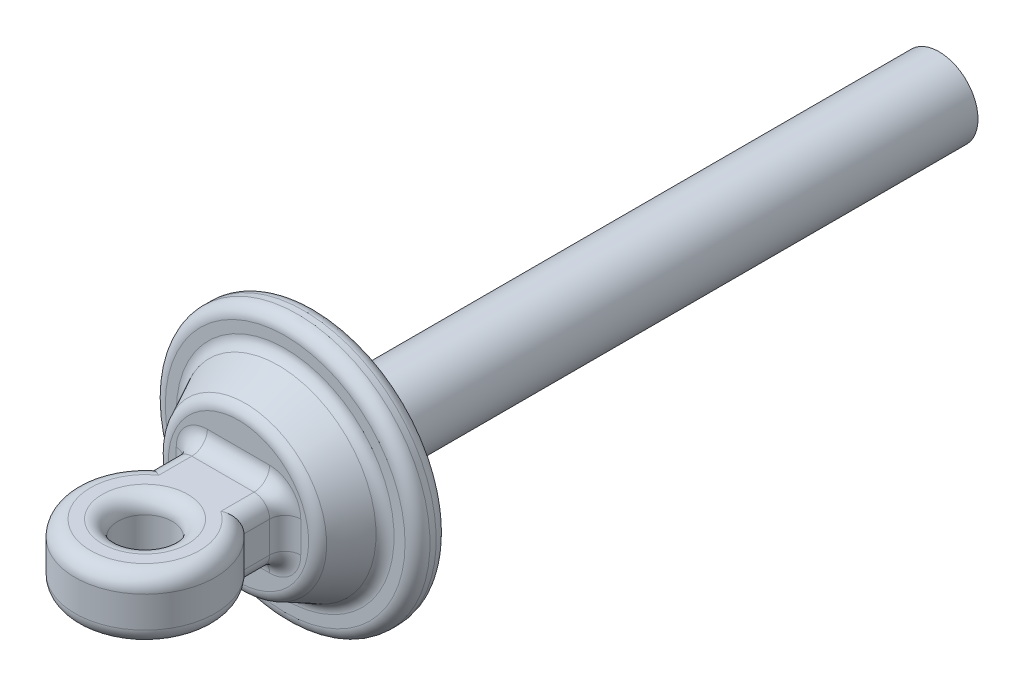
ISO-10303-21;
HEADER;
FILE_DESCRIPTION(('STEP AP214'),'2;1');
FILE_NAME('part.step','',(''),(''),'','','');
FILE_SCHEMA(('AUTOMOTIVE_DESIGN { 1 0 10303 214 1 1 1 1 }'));
ENDSEC;
DATA;
#1=APPLICATION_CONTEXT('core data for automotive mechanical design processes');
#2=APPLICATION_PROTOCOL_DEFINITION('international standard','automotive_design',2000,#1);
#3=PRODUCT_CONTEXT('',#1,'mechanical');
#4=PRODUCT('Part','Part','',(#3));
#5=PRODUCT_RELATED_PRODUCT_CATEGORY('part','',(#4));
#6=PRODUCT_DEFINITION_FORMATION('','',#4);
#7=PRODUCT_DEFINITION_CONTEXT('part definition',#1,'design');
#8=PRODUCT_DEFINITION('design','',#6,#7);
#9=PRODUCT_DEFINITION_SHAPE('','',#8);
#10=(LENGTH_UNIT() NAMED_UNIT(*) SI_UNIT(.MILLI.,.METRE.));
#11=(NAMED_UNIT(*) PLANE_ANGLE_UNIT() SI_UNIT($,.RADIAN.));
#12=(NAMED_UNIT(*) SI_UNIT($,.STERADIAN.) SOLID_ANGLE_UNIT());
#13=UNCERTAINTY_MEASURE_WITH_UNIT(LENGTH_MEASURE(1.E-05),#10,'distance_accuracy_value','');
#14=(GEOMETRIC_REPRESENTATION_CONTEXT(3) GLOBAL_UNCERTAINTY_ASSIGNED_CONTEXT((#13)) GLOBAL_UNIT_ASSIGNED_CONTEXT((#10,
#11,#12)) REPRESENTATION_CONTEXT('',''));
#15=CARTESIAN_POINT('',(0.,0.,0.));
#16=DIRECTION('',(0.,0.,1.));
#17=DIRECTION('',(1.,0.,0.));
#18=AXIS2_PLACEMENT_3D('',#15,#16,#17);
#19=CARTESIAN_POINT('',(0.,0.,45.));
#20=DIRECTION('',(0.,0.,-1.));
#21=DIRECTION('',(-1.,0.,0.));
#22=AXIS2_PLACEMENT_3D('',#19,#20,#21);
#23=PLANE('',#22);
#24=CARTESIAN_POINT('',(0.,0.,45.));
#25=DIRECTION('',(0.,0.,-1.));
#26=DIRECTION('',(-1.,0.,0.));
#27=AXIS2_PLACEMENT_3D('',#24,#25,#26);
#28=CIRCLE('',#27,4.50557280900008);
#29=CARTESIAN_POINT('',(-4.50557280900008,0.,45.));
#30=VERTEX_POINT('',#29);
#31=EDGE_CURVE('E243',#30,#30,#28,.T.);
#32=ORIENTED_EDGE('',*,*,#31,.F.);
#33=EDGE_LOOP('',(#32));
#34=FACE_BOUND('',#33,.T.);
#35=CARTESIAN_POINT('',(-2.,1.,45.));
#36=DIRECTION('',(0.,0.,-1.));
#37=DIRECTION('',(-1.,0.,0.));
#38=AXIS2_PLACEMENT_3D('',#35,#36,#37);
#39=CIRCLE('',#38,2.);
#40=CARTESIAN_POINT('',(-2.,3.,45.));
#41=VERTEX_POINT('',#40);
#42=CARTESIAN_POINT('',(-4.,1.,45.));
#43=VERTEX_POINT('',#42);
#44=EDGE_CURVE('E270',#41,#43,#39,.F.);
#45=ORIENTED_EDGE('',*,*,#44,.F.);
#46=DIRECTION('',(1.,0.,0.));
#47=VECTOR('',#46,1.);
#48=CARTESIAN_POINT('',(0.,3.,45.));
#49=LINE('',#48,#47);
#50=CARTESIAN_POINT('',(2.,3.,45.));
#51=VERTEX_POINT('',#50);
#52=EDGE_CURVE('E267',#41,#51,#49,.T.);
#53=ORIENTED_EDGE('',*,*,#52,.T.);
#54=CARTESIAN_POINT('',(2.,1.,45.));
#55=DIRECTION('',(0.,0.,-1.));
#56=DIRECTION('',(-1.,0.,0.));
#57=AXIS2_PLACEMENT_3D('',#54,#55,#56);
#58=CIRCLE('',#57,2.);
#59=CARTESIAN_POINT('',(4.,1.,45.));
#60=VERTEX_POINT('',#59);
#61=EDGE_CURVE('E263',#60,#51,#58,.F.);
#62=ORIENTED_EDGE('',*,*,#61,.F.);
#63=DIRECTION('',(0.,-1.,0.));
#64=VECTOR('',#63,1.);
#65=CARTESIAN_POINT('',(4.,0.,45.));
#66=LINE('',#65,#64);
#67=CARTESIAN_POINT('',(4.,-1.,45.));
#68=VERTEX_POINT('',#67);
#69=EDGE_CURVE('E259',#60,#68,#66,.T.);
#70=ORIENTED_EDGE('',*,*,#69,.T.);
#71=CARTESIAN_POINT('',(2.,-1.,45.));
#72=DIRECTION('',(0.,0.,-1.));
#73=DIRECTION('',(-1.,0.,0.));
#74=AXIS2_PLACEMENT_3D('',#71,#72,#73);
#75=CIRCLE('',#74,2.);
#76=CARTESIAN_POINT('',(2.,-3.,45.));
#77=VERTEX_POINT('',#76);
#78=EDGE_CURVE('E177',#77,#68,#75,.F.);
#79=ORIENTED_EDGE('',*,*,#78,.F.);
#80=DIRECTION('',(1.,0.,0.));
#81=VECTOR('',#80,1.);
#82=CARTESIAN_POINT('',(-3.,-3.,45.));
#83=LINE('',#82,#81);
#84=CARTESIAN_POINT('',(-2.,-3.,45.));
#85=VERTEX_POINT('',#84);
#86=EDGE_CURVE('E159',#77,#85,#83,.F.);
#87=ORIENTED_EDGE('',*,*,#86,.T.);
#88=CARTESIAN_POINT('',(-2.,-1.,45.));
#89=DIRECTION('',(0.,0.,-1.));
#90=DIRECTION('',(-1.,0.,0.));
#91=AXIS2_PLACEMENT_3D('',#88,#89,#90);
#92=CIRCLE('',#91,2.);
#93=CARTESIAN_POINT('',(-4.,-1.,45.));
#94=VERTEX_POINT('',#93);
#95=EDGE_CURVE('E154',#94,#85,#92,.F.);
#96=ORIENTED_EDGE('',*,*,#95,.F.);
#97=DIRECTION('',(0.,-1.,0.));
#98=VECTOR('',#97,1.);
#99=CARTESIAN_POINT('',(-4.,2.,45.));
#100=LINE('',#99,#98);
#101=EDGE_CURVE('E156',#94,#43,#100,.F.);
#102=ORIENTED_EDGE('',*,*,#101,.T.);
#103=EDGE_LOOP('',(#45,#53,#62,#70,#79,#87,#96,#102));
#104=FACE_BOUND('',#103,.T.);
#105=ADVANCED_FACE('F58',(#34,#104),#23,.F.);
#106=CARTESIAN_POINT('',(0.,0.,40.));
#107=DIRECTION('',(0.,0.,-1.));
#108=DIRECTION('',(-1.,0.,0.));
#109=AXIS2_PLACEMENT_3D('',#106,#107,#108);
#110=CYLINDRICAL_SURFACE('',#109,2.5);
#111=CARTESIAN_POINT('',(0.,0.,40.));
#112=DIRECTION('',(0.,0.,1.));
#113=DIRECTION('',(1.,0.,0.));
#114=AXIS2_PLACEMENT_3D('',#111,#112,#113);
#115=CIRCLE('',#114,2.5);
#116=CARTESIAN_POINT('',(2.5,0.,40.));
#117=VERTEX_POINT('',#116);
#118=EDGE_CURVE('E165',#117,#117,#115,.T.);
#119=ORIENTED_EDGE('',*,*,#118,.F.);
#120=EDGE_LOOP('',(#119));
#121=FACE_BOUND('',#120,.T.);
#122=CARTESIAN_POINT('',(0.,0.,0.));
#123=DIRECTION('',(0.,0.,1.));
#124=DIRECTION('',(1.,0.,0.));
#125=AXIS2_PLACEMENT_3D('',#122,#123,#124);
#126=CIRCLE('',#125,2.5);
#127=CARTESIAN_POINT('',(2.5,0.,0.));
#128=VERTEX_POINT('',#127);
#129=EDGE_CURVE('E247',#128,#128,#126,.T.);
#130=ORIENTED_EDGE('',*,*,#129,.T.);
#131=EDGE_LOOP('',(#130));
#132=FACE_BOUND('',#131,.T.);
#133=ADVANCED_FACE('F435',(#121,#132),#110,.T.);
#134=CARTESIAN_POINT('',(0.,0.,0.));
#135=DIRECTION('',(0.,0.,1.));
#136=DIRECTION('',(1.,0.,0.));
#137=AXIS2_PLACEMENT_3D('',#134,#135,#136);
#138=PLANE('',#137);
#139=ORIENTED_EDGE('',*,*,#129,.F.);
#140=EDGE_LOOP('',(#139));
#141=FACE_BOUND('',#140,.T.);
#142=ADVANCED_FACE('F441',(#141),#138,.F.);
#143=CARTESIAN_POINT('',(0.,0.,40.));
#144=DIRECTION('',(0.,0.,1.));
#145=DIRECTION('',(1.,0.,0.));
#146=AXIS2_PLACEMENT_3D('',#143,#144,#145);
#147=PLANE('',#146);
#148=ORIENTED_EDGE('',*,*,#118,.T.);
#149=EDGE_LOOP('',(#148));
#150=FACE_BOUND('',#149,.T.);
#151=CARTESIAN_POINT('',(0.,0.,40.));
#152=DIRECTION('',(0.,0.,-1.));
#153=DIRECTION('',(-1.,0.,0.));
#154=AXIS2_PLACEMENT_3D('',#151,#152,#153);
#155=CIRCLE('',#154,7.69999999999999);
#156=CARTESIAN_POINT('',(-7.69999999999999,0.,40.));
#157=VERTEX_POINT('',#156);
#158=EDGE_CURVE('E213',#157,#157,#155,.T.);
#159=ORIENTED_EDGE('',*,*,#158,.T.);
#160=EDGE_LOOP('',(#159));
#161=FACE_BOUND('',#160,.T.);
#162=ADVANCED_FACE('F449',(#150,#161),#147,.F.);
#163=CARTESIAN_POINT('',(0.,0.,44.2));
#164=DIRECTION('',(0.,0.,-1.));
#165=DIRECTION('',(-1.,0.,0.));
#166=AXIS2_PLACEMENT_3D('',#163,#164,#165);
#167=TOROIDAL_SURFACE('',#166,4.50557280900008,0.800000000000002);
#168=CARTESIAN_POINT('',(0.,0.,44.5577708764));
#169=DIRECTION('',(0.,0.,-1.));
#170=DIRECTION('',(-1.,0.,0.));
#171=AXIS2_PLACEMENT_3D('',#168,#169,#170);
#172=CIRCLE('',#171,5.22111456180002);
#173=CARTESIAN_POINT('',(-5.22111456180002,0.,44.5577708764));
#174=VERTEX_POINT('',#173);
#175=EDGE_CURVE('E239',#174,#174,#172,.T.);
#176=ORIENTED_EDGE('',*,*,#175,.F.);
#177=EDGE_LOOP('',(#176));
#178=FACE_BOUND('',#177,.T.);
#179=ORIENTED_EDGE('',*,*,#31,.T.);
#180=EDGE_LOOP('',(#179));
#181=FACE_BOUND('',#180,.T.);
#182=ADVANCED_FACE('F447',(#178,#181),#167,.T.);
#183=CARTESIAN_POINT('',(0.,0.,44.5577708764));
#184=DIRECTION('',(0.,0.,-1.));
#185=DIRECTION('',(-1.,0.,0.));
#186=AXIS2_PLACEMENT_3D('',#183,#184,#185);
#187=CONICAL_SURFACE('',#186,5.22111456180002,0.463647609000805);
#188=CARTESIAN_POINT('',(0.,0.,42.4422291236));
#189=DIRECTION('',(0.,0.,-1.));
#190=DIRECTION('',(-1.,0.,0.));
#191=AXIS2_PLACEMENT_3D('',#188,#189,#190);
#192=CIRCLE('',#191,6.27888543819998);
#193=CARTESIAN_POINT('',(-6.27888543819998,0.,42.4422291236));
#194=VERTEX_POINT('',#193);
#195=EDGE_CURVE('E235',#194,#194,#192,.T.);
#196=ORIENTED_EDGE('',*,*,#195,.F.);
#197=EDGE_LOOP('',(#196));
#198=FACE_BOUND('',#197,.T.);
#199=ORIENTED_EDGE('',*,*,#175,.T.);
#200=EDGE_LOOP('',(#199));
#201=FACE_BOUND('',#200,.T.);
#202=ADVANCED_FACE('F527',(#198,#201),#187,.T.);
#203=CARTESIAN_POINT('',(0.,0.,42.8));
#204=DIRECTION('',(0.,0.,-1.));
#205=DIRECTION('',(-1.,0.,0.));
#206=AXIS2_PLACEMENT_3D('',#203,#204,#205);
#207=TOROIDAL_SURFACE('',#206,6.99442719099992,0.800000000000002);
#208=CARTESIAN_POINT('',(0.,0.,42.));
#209=DIRECTION('',(0.,0.,-1.));
#210=DIRECTION('',(-1.,0.,0.));
#211=AXIS2_PLACEMENT_3D('',#208,#209,#210);
#212=CIRCLE('',#211,6.99442719099992);
#213=CARTESIAN_POINT('',(-6.99442719099992,0.,42.));
#214=VERTEX_POINT('',#213);
#215=EDGE_CURVE('E231',#214,#214,#212,.T.);
#216=ORIENTED_EDGE('',*,*,#215,.F.);
#217=EDGE_LOOP('',(#216));
#218=FACE_BOUND('',#217,.T.);
#219=ORIENTED_EDGE('',*,*,#195,.T.);
#220=EDGE_LOOP('',(#219));
#221=FACE_BOUND('',#220,.T.);
#222=ADVANCED_FACE('F524',(#218,#221),#207,.F.);
#223=CARTESIAN_POINT('',(6.99442719099992,0.,42.));
#224=DIRECTION('',(0.,0.,-1.));
#225=DIRECTION('',(-1.,0.,0.));
#226=AXIS2_PLACEMENT_3D('',#223,#224,#225);
#227=PLANE('',#226);
#228=CARTESIAN_POINT('',(0.,0.,42.));
#229=DIRECTION('',(0.,0.,-1.));
#230=DIRECTION('',(-1.,0.,0.));
#231=AXIS2_PLACEMENT_3D('',#228,#229,#230);
#232=CIRCLE('',#231,7.69999999999999);
#233=CARTESIAN_POINT('',(-7.69999999999999,0.,42.));
#234=VERTEX_POINT('',#233);
#235=EDGE_CURVE('E227',#234,#234,#232,.T.);
#236=ORIENTED_EDGE('',*,*,#235,.F.);
#237=EDGE_LOOP('',(#236));
#238=FACE_BOUND('',#237,.T.);
#239=ORIENTED_EDGE('',*,*,#215,.T.);
#240=EDGE_LOOP('',(#239));
#241=FACE_BOUND('',#240,.T.);
#242=ADVANCED_FACE('F520',(#238,#241),#227,.F.);
#243=CARTESIAN_POINT('',(0.,0.,41.2));
#244=DIRECTION('',(0.,0.,-1.));
#245=DIRECTION('',(-1.,0.,0.));
#246=AXIS2_PLACEMENT_3D('',#243,#244,#245);
#247=TOROIDAL_SURFACE('',#246,7.7,0.800000000000001);
#248=CARTESIAN_POINT('',(0.,0.,41.2));
#249=DIRECTION('',(0.,0.,-1.));
#250=DIRECTION('',(-1.,0.,0.));
#251=AXIS2_PLACEMENT_3D('',#248,#249,#250);
#252=CIRCLE('',#251,8.5);
#253=CARTESIAN_POINT('',(-8.5,0.,41.2));
#254=VERTEX_POINT('',#253);
#255=EDGE_CURVE('E223',#254,#254,#252,.T.);
#256=ORIENTED_EDGE('',*,*,#255,.F.);
#257=EDGE_LOOP('',(#256));
#258=FACE_BOUND('',#257,.T.);
#259=ORIENTED_EDGE('',*,*,#235,.T.);
#260=EDGE_LOOP('',(#259));
#261=FACE_BOUND('',#260,.T.);
#262=ADVANCED_FACE('F516',(#258,#261),#247,.T.);
#263=CARTESIAN_POINT('',(0.,0.,40.));
#264=DIRECTION('',(0.,0.,-1.));
#265=DIRECTION('',(-1.,0.,0.));
#266=AXIS2_PLACEMENT_3D('',#263,#264,#265);
#267=CYLINDRICAL_SURFACE('',#266,8.5);
#268=CARTESIAN_POINT('',(0.,0.,40.8));
#269=DIRECTION('',(0.,0.,-1.));
#270=DIRECTION('',(-1.,0.,0.));
#271=AXIS2_PLACEMENT_3D('',#268,#269,#270);
#272=CIRCLE('',#271,8.5);
#273=CARTESIAN_POINT('',(-8.5,0.,40.8));
#274=VERTEX_POINT('',#273);
#275=EDGE_CURVE('E219',#274,#274,#272,.T.);
#276=ORIENTED_EDGE('',*,*,#275,.F.);
#277=EDGE_LOOP('',(#276));
#278=FACE_BOUND('',#277,.T.);
#279=ORIENTED_EDGE('',*,*,#255,.T.);
#280=EDGE_LOOP('',(#279));
#281=FACE_BOUND('',#280,.T.);
#282=ADVANCED_FACE('F503',(#278,#281),#267,.T.);
#283=CARTESIAN_POINT('',(0.,0.,40.8));
#284=DIRECTION('',(0.,0.,-1.));
#285=DIRECTION('',(-1.,0.,0.));
#286=AXIS2_PLACEMENT_3D('',#283,#284,#285);
#287=TOROIDAL_SURFACE('',#286,7.7,0.800000000000001);
#288=ORIENTED_EDGE('',*,*,#158,.F.);
#289=EDGE_LOOP('',(#288));
#290=FACE_BOUND('',#289,.T.);
#291=ORIENTED_EDGE('',*,*,#275,.T.);
#292=EDGE_LOOP('',(#291));
#293=FACE_BOUND('',#292,.T.);
#294=ADVANCED_FACE('F494',(#290,#293),#287,.T.);
#295=CARTESIAN_POINT('',(0.,2.,51.));
#296=DIRECTION('',(0.,1.,0.));
#297=DIRECTION('',(0.,0.,1.));
#298=AXIS2_PLACEMENT_3D('',#295,#296,#297);
#299=PLANE('',#298);
#300=CARTESIAN_POINT('',(0.,2.,51.));
#301=DIRECTION('',(0.,1.,0.));
#302=DIRECTION('',(0.,0.,1.));
#303=AXIS2_PLACEMENT_3D('',#300,#301,#302);
#304=CIRCLE('',#303,2.75);
#305=CARTESIAN_POINT('',(0.,2.,53.75));
#306=VERTEX_POINT('',#305);
#307=EDGE_CURVE('E313',#306,#306,#304,.F.);
#308=ORIENTED_EDGE('',*,*,#307,.T.);
#309=EDGE_LOOP('',(#308));
#310=FACE_BOUND('',#309,.T.);
#311=DIRECTION('',(0.,0.,1.));
#312=VECTOR('',#311,1.);
#313=CARTESIAN_POINT('',(2.,2.,51.));
#314=LINE('',#313,#312);
#315=CARTESIAN_POINT('',(2.,2.,48.127718676731));
#316=VERTEX_POINT('',#315);
#317=CARTESIAN_POINT('',(2.,2.,46.));
#318=VERTEX_POINT('',#317);
#319=EDGE_CURVE('E306',#316,#318,#314,.F.);
#320=ORIENTED_EDGE('',*,*,#319,.T.);
#321=DIRECTION('',(1.,0.,0.));
#322=VECTOR('',#321,1.);
#323=CARTESIAN_POINT('',(0.,2.,46.));
#324=LINE('',#323,#322);
#325=CARTESIAN_POINT('',(-2.,2.,46.));
#326=VERTEX_POINT('',#325);
#327=EDGE_CURVE('E309',#318,#326,#324,.F.);
#328=ORIENTED_EDGE('',*,*,#327,.T.);
#329=DIRECTION('',(0.,0.,1.));
#330=VECTOR('',#329,1.);
#331=CARTESIAN_POINT('',(-2.,2.,47.6458980337503));
#332=LINE('',#331,#330);
#333=CARTESIAN_POINT('',(-2.,2.,48.127718676731));
#334=VERTEX_POINT('',#333);
#335=EDGE_CURVE('E300',#326,#334,#332,.T.);
#336=ORIENTED_EDGE('',*,*,#335,.T.);
#337=CARTESIAN_POINT('',(0.,2.,51.));
#338=DIRECTION('',(0.,1.,0.));
#339=DIRECTION('',(0.,0.,1.));
#340=AXIS2_PLACEMENT_3D('',#337,#338,#339);
#341=CIRCLE('',#340,3.5);
#342=EDGE_CURVE('E303',#334,#316,#341,.T.);
#343=ORIENTED_EDGE('',*,*,#342,.T.);
#344=EDGE_LOOP('',(#320,#328,#336,#343));
#345=FACE_BOUND('',#344,.T.);
#346=ADVANCED_FACE('F492',(#310,#345),#299,.T.);
#347=CARTESIAN_POINT('',(0.,-2.,51.));
#348=DIRECTION('',(0.,1.,0.));
#349=DIRECTION('',(0.,0.,1.));
#350=AXIS2_PLACEMENT_3D('',#347,#348,#349);
#351=PLANE('',#350);
#352=CARTESIAN_POINT('',(0.,-2.,51.));
#353=DIRECTION('',(0.,1.,0.));
#354=DIRECTION('',(0.,0.,1.));
#355=AXIS2_PLACEMENT_3D('',#352,#353,#354);
#356=CIRCLE('',#355,2.75);
#357=CARTESIAN_POINT('',(0.,-2.,53.75));
#358=VERTEX_POINT('',#357);
#359=EDGE_CURVE('E12',#358,#358,#356,.T.);
#360=ORIENTED_EDGE('',*,*,#359,.T.);
#361=EDGE_LOOP('',(#360));
#362=FACE_BOUND('',#361,.T.);
#363=DIRECTION('',(0.,0.,1.));
#364=VECTOR('',#363,1.);
#365=CARTESIAN_POINT('',(2.,-2.,47.6458980337503));
#366=LINE('',#365,#364);
#367=CARTESIAN_POINT('',(2.,-2.,46.));
#368=VERTEX_POINT('',#367);
#369=CARTESIAN_POINT('',(2.,-2.,48.127718676731));
#370=VERTEX_POINT('',#369);
#371=EDGE_CURVE('E82',#368,#370,#366,.T.);
#372=ORIENTED_EDGE('',*,*,#371,.T.);
#373=CARTESIAN_POINT('',(0.,-2.,51.));
#374=DIRECTION('',(0.,1.,0.));
#375=DIRECTION('',(0.,0.,1.));
#376=AXIS2_PLACEMENT_3D('',#373,#374,#375);
#377=CIRCLE('',#376,3.5);
#378=CARTESIAN_POINT('',(-2.,-2.,48.127718676731));
#379=VERTEX_POINT('',#378);
#380=EDGE_CURVE('E74',#370,#379,#377,.F.);
#381=ORIENTED_EDGE('',*,*,#380,.T.);
#382=DIRECTION('',(0.,0.,1.));
#383=VECTOR('',#382,1.);
#384=CARTESIAN_POINT('',(-2.,-2.,51.));
#385=LINE('',#384,#383);
#386=CARTESIAN_POINT('',(-2.,-2.,46.));
#387=VERTEX_POINT('',#386);
#388=EDGE_CURVE('E323',#379,#387,#385,.F.);
#389=ORIENTED_EDGE('',*,*,#388,.T.);
#390=DIRECTION('',(1.,0.,0.));
#391=VECTOR('',#390,1.);
#392=CARTESIAN_POINT('',(3.,-2.,46.));
#393=LINE('',#392,#391);
#394=EDGE_CURVE('E87',#387,#368,#393,.T.);
#395=ORIENTED_EDGE('',*,*,#394,.T.);
#396=EDGE_LOOP('',(#372,#381,#389,#395));
#397=FACE_BOUND('',#396,.T.);
#398=ADVANCED_FACE('F484',(#362,#397),#351,.F.);
#399=CARTESIAN_POINT('',(-3.,2.,45.));
#400=DIRECTION('',(1.,0.,0.));
#401=DIRECTION('',(0.,0.,-1.));
#402=AXIS2_PLACEMENT_3D('',#399,#400,#401);
#403=PLANE('',#402);
#404=DIRECTION('',(0.,-1.,0.));
#405=VECTOR('',#404,1.);
#406=CARTESIAN_POINT('',(-3.,2.,47.6458980337503));
#407=LINE('',#406,#405);
#408=CARTESIAN_POINT('',(-3.,1.,47.6458980337503));
#409=VERTEX_POINT('',#408);
#410=CARTESIAN_POINT('',(-3.,-1.,47.6458980337503));
#411=VERTEX_POINT('',#410);
#412=EDGE_CURVE('E206',#409,#411,#407,.T.);
#413=ORIENTED_EDGE('',*,*,#412,.F.);
#414=DIRECTION('',(0.,0.,1.));
#415=VECTOR('',#414,1.);
#416=CARTESIAN_POINT('',(-3.,1.,45.));
#417=LINE('',#416,#415);
#418=CARTESIAN_POINT('',(-3.,1.,46.));
#419=VERTEX_POINT('',#418);
#420=EDGE_CURVE('E289',#409,#419,#417,.F.);
#421=ORIENTED_EDGE('',*,*,#420,.T.);
#422=DIRECTION('',(0.,-1.,0.));
#423=VECTOR('',#422,1.);
#424=CARTESIAN_POINT('',(-3.,-2.,46.));
#425=LINE('',#424,#423);
#426=CARTESIAN_POINT('',(-3.,-1.,46.));
#427=VERTEX_POINT('',#426);
#428=EDGE_CURVE('E286',#419,#427,#425,.T.);
#429=ORIENTED_EDGE('',*,*,#428,.T.);
#430=DIRECTION('',(0.,0.,1.));
#431=VECTOR('',#430,1.);
#432=CARTESIAN_POINT('',(-3.,-1.,45.));
#433=LINE('',#432,#431);
#434=EDGE_CURVE('E283',#427,#411,#433,.T.);
#435=ORIENTED_EDGE('',*,*,#434,.T.);
#436=EDGE_LOOP('',(#413,#421,#429,#435));
#437=FACE_BOUND('',#436,.T.);
#438=ADVANCED_FACE('F488',(#437),#403,.F.);
#439=CARTESIAN_POINT('',(0.,2.,51.));
#440=DIRECTION('',(0.,-1.,0.));
#441=DIRECTION('',(0.,0.,-1.));
#442=AXIS2_PLACEMENT_3D('',#439,#440,#441);
#443=CYLINDRICAL_SURFACE('',#442,4.5);
#444=DIRECTION('',(0.,-1.,0.));
#445=VECTOR('',#444,1.);
#446=CARTESIAN_POINT('',(3.,2.,47.6458980337503));
#447=LINE('',#446,#445);
#448=CARTESIAN_POINT('',(3.,1.,47.6458980337503));
#449=VERTEX_POINT('',#448);
#450=CARTESIAN_POINT('',(3.,-1.,47.6458980337503));
#451=VERTEX_POINT('',#450);
#452=EDGE_CURVE('E199',#449,#451,#447,.T.);
#453=ORIENTED_EDGE('',*,*,#452,.F.);
#454=CARTESIAN_POINT('',(0.,1.,51.));
#455=DIRECTION('',(0.,1.,0.));
#456=DIRECTION('',(0.,0.,1.));
#457=AXIS2_PLACEMENT_3D('',#454,#455,#456);
#458=CIRCLE('',#457,4.5);
#459=EDGE_CURVE('E320',#449,#409,#458,.F.);
#460=ORIENTED_EDGE('',*,*,#459,.T.);
#461=ORIENTED_EDGE('',*,*,#412,.T.);
#462=CARTESIAN_POINT('',(0.,-1.,51.));
#463=DIRECTION('',(0.,1.,0.));
#464=DIRECTION('',(0.,0.,1.));
#465=AXIS2_PLACEMENT_3D('',#462,#463,#464);
#466=CIRCLE('',#465,4.5);
#467=EDGE_CURVE('E317',#411,#451,#466,.T.);
#468=ORIENTED_EDGE('',*,*,#467,.T.);
#469=EDGE_LOOP('',(#453,#460,#461,#468));
#470=FACE_BOUND('',#469,.T.);
#471=ADVANCED_FACE('F491',(#470),#443,.T.);
#472=CARTESIAN_POINT('',(3.,2.,45.));
#473=DIRECTION('',(1.,0.,0.));
#474=DIRECTION('',(0.,0.,-1.));
#475=AXIS2_PLACEMENT_3D('',#472,#473,#474);
#476=PLANE('',#475);
#477=DIRECTION('',(0.,-1.,0.));
#478=VECTOR('',#477,1.);
#479=CARTESIAN_POINT('',(3.,2.,46.));
#480=LINE('',#479,#478);
#481=CARTESIAN_POINT('',(3.,-1.,46.));
#482=VERTEX_POINT('',#481);
#483=CARTESIAN_POINT('',(3.,1.,46.));
#484=VERTEX_POINT('',#483);
#485=EDGE_CURVE('E276',#482,#484,#480,.F.);
#486=ORIENTED_EDGE('',*,*,#485,.T.);
#487=DIRECTION('',(0.,0.,1.));
#488=VECTOR('',#487,1.);
#489=CARTESIAN_POINT('',(3.,1.,45.));
#490=LINE('',#489,#488);
#491=EDGE_CURVE('E280',#484,#449,#490,.T.);
#492=ORIENTED_EDGE('',*,*,#491,.T.);
#493=ORIENTED_EDGE('',*,*,#452,.T.);
#494=DIRECTION('',(0.,0.,1.));
#495=VECTOR('',#494,1.);
#496=CARTESIAN_POINT('',(3.,-1.,45.));
#497=LINE('',#496,#495);
#498=EDGE_CURVE('E273',#451,#482,#497,.F.);
#499=ORIENTED_EDGE('',*,*,#498,.T.);
#500=EDGE_LOOP('',(#486,#492,#493,#499));
#501=FACE_BOUND('',#500,.T.);
#502=ADVANCED_FACE('F472',(#501),#476,.T.);
#503=CARTESIAN_POINT('',(0.,2.,51.));
#504=DIRECTION('',(0.,-1.,0.));
#505=DIRECTION('',(0.,0.,-1.));
#506=AXIS2_PLACEMENT_3D('',#503,#504,#505);
#507=CYLINDRICAL_SURFACE('',#506,1.75);
#508=CARTESIAN_POINT('',(0.,1.,51.));
#509=DIRECTION('',(0.,1.,0.));
#510=DIRECTION('',(0.,0.,1.));
#511=AXIS2_PLACEMENT_3D('',#508,#509,#510);
#512=CIRCLE('',#511,1.75);
#513=CARTESIAN_POINT('',(0.,1.,52.75));
#514=VERTEX_POINT('',#513);
#515=EDGE_CURVE('E296',#514,#514,#512,.T.);
#516=ORIENTED_EDGE('',*,*,#515,.T.);
#517=EDGE_LOOP('',(#516));
#518=FACE_BOUND('',#517,.T.);
#519=CARTESIAN_POINT('',(0.,-1.,51.));
#520=DIRECTION('',(0.,1.,0.));
#521=DIRECTION('',(0.,0.,1.));
#522=AXIS2_PLACEMENT_3D('',#519,#520,#521);
#523=CIRCLE('',#522,1.75);
#524=CARTESIAN_POINT('',(0.,-1.,52.75));
#525=VERTEX_POINT('',#524);
#526=EDGE_CURVE('E292',#525,#525,#523,.F.);
#527=ORIENTED_EDGE('',*,*,#526,.T.);
#528=EDGE_LOOP('',(#527));
#529=FACE_BOUND('',#528,.T.);
#530=ADVANCED_FACE('F417',(#518,#529),#507,.F.);
#531=CARTESIAN_POINT('',(-2.,1.,51.));
#532=DIRECTION('',(0.,0.,-1.));
#533=DIRECTION('',(-1.,0.,0.));
#534=AXIS2_PLACEMENT_3D('',#531,#532,#533);
#535=CYLINDRICAL_SURFACE('',#534,1.);
#536=CARTESIAN_POINT('',(-2.,1.,46.));
#537=DIRECTION('',(0.,0.,-1.));
#538=DIRECTION('',(-1.,0.,0.));
#539=AXIS2_PLACEMENT_3D('',#536,#537,#538);
#540=CIRCLE('',#539,1.);
#541=EDGE_CURVE('E186',#419,#326,#540,.T.);
#542=ORIENTED_EDGE('',*,*,#541,.F.);
#543=ORIENTED_EDGE('',*,*,#420,.F.);
#544=CARTESIAN_POINT('',(-3.,1.,47.6458980337503));
#545=CARTESIAN_POINT('',(-3.00000097105649,1.02630901509487,47.6458979128971));
#546=CARTESIAN_POINT('',(-2.99896100253066,1.05260481013211,47.6463626536066));
#547=CARTESIAN_POINT('',(-2.9948198686927,1.10499543561608,47.6482152696016));
#548=CARTESIAN_POINT('',(-2.99171913201631,1.13109030671305,47.6496029529169));
#549=CARTESIAN_POINT('',(-2.97938704439248,1.20863389283069,47.6551269801151));
#550=CARTESIAN_POINT('',(-2.96712545875701,1.25954145453452,47.6606244235047));
#551=CARTESIAN_POINT('',(-2.93503811724398,1.35833695381536,47.6750690517013));
#552=CARTESIAN_POINT('',(-2.9152145676827,1.40622576741295,47.6840152302961));
#553=CARTESIAN_POINT('',(-2.8687843441351,1.4978471737876,47.7050851719359));
#554=CARTESIAN_POINT('',(-2.84217496123138,1.54157809713348,47.7172102040396));
#555=CARTESIAN_POINT('',(-2.7821775676682,1.62524734120294,47.7447384552721));
#556=CARTESIAN_POINT('',(-2.74859790676442,1.66501693208268,47.760235137673));
#557=CARTESIAN_POINT('',(-2.67637494999627,1.73835484993573,47.7938485472748));
#558=CARTESIAN_POINT('',(-2.63773026148865,1.77192146524429,47.8119659952048));
#559=CARTESIAN_POINT('',(-2.55319712594679,1.83484830161591,47.8519810770229));
#560=CARTESIAN_POINT('',(-2.50697467663187,1.86363937625219,47.8740667406885));
#561=CARTESIAN_POINT('',(-2.41130991840184,1.91308609636724,47.9203142273498));
#562=CARTESIAN_POINT('',(-2.36186555530879,1.93373649131353,47.9444773780759));
#563=CARTESIAN_POINT('',(-2.26167043561409,1.96658011701135,47.9940693288371));
#564=CARTESIAN_POINT('',(-2.21094208974194,1.97887062314417,48.0194797476213));
#565=CARTESIAN_POINT('',(-2.10880392672979,1.99540456169973,48.0713345127757));
#566=CARTESIAN_POINT('',(-2.05739562714484,1.99966360088614,48.0977767517877));
#567=CARTESIAN_POINT('',(-2.00412579877084,1.99999363037608,48.1255646503612));
#568=CARTESIAN_POINT('',(-2.00206271615261,2.00000001355537,48.1266414537713));
#569=CARTESIAN_POINT('',(-2.,2.,48.127718676731));
#570=B_SPLINE_CURVE_WITH_KNOTS('',3,(#544,#545,#546,#547,#548,#549,#550,#551,#552,#553,#554,
#555,#556,#557,#558,#559,#560,#561,#562,#563,#564,#565,#566,#567,#568,#569),.UNSPECIFIED.,.F.,
.F.,(4,2,2,2,2,2,2,2,2,2,2,2,4),(0.,0.0788764496467869,0.157736498278996,0.314864929107356,
0.471947550383106,0.629092977767608,0.791328554360696,0.953608832017074,1.12917135093585,
1.30484691869941,1.47844166216896,1.65169872695729,1.65868028216447),.UNSPECIFIED.);
#571=EDGE_CURVE('E62',#334,#409,#570,.F.);
#572=ORIENTED_EDGE('',*,*,#571,.F.);
#573=ORIENTED_EDGE('',*,*,#335,.F.);
#574=EDGE_LOOP('',(#542,#543,#572,#573));
#575=FACE_BOUND('',#574,.T.);
#576=ADVANCED_FACE('F413',(#575),#535,.T.);
#577=CARTESIAN_POINT('',(-4.,2.,46.));
#578=DIRECTION('',(0.,1.,0.));
#579=DIRECTION('',(0.,0.,1.));
#580=AXIS2_PLACEMENT_3D('',#577,#578,#579);
#581=CYLINDRICAL_SURFACE('',#580,1.);
#582=CARTESIAN_POINT('',(-4.,-1.,46.));
#583=DIRECTION('',(0.,1.,0.));
#584=DIRECTION('',(0.,0.,1.));
#585=AXIS2_PLACEMENT_3D('',#582,#583,#584);
#586=CIRCLE('',#585,1.);
#587=EDGE_CURVE('E171',#427,#94,#586,.T.);
#588=ORIENTED_EDGE('',*,*,#587,.F.);
#589=ORIENTED_EDGE('',*,*,#428,.F.);
#590=CARTESIAN_POINT('',(-4.,1.,46.));
#591=DIRECTION('',(0.,-1.,0.));
#592=DIRECTION('',(0.,0.,-1.));
#593=AXIS2_PLACEMENT_3D('',#590,#591,#592);
#594=CIRCLE('',#593,1.);
#595=EDGE_CURVE('E174',#43,#419,#594,.T.);
#596=ORIENTED_EDGE('',*,*,#595,.F.);
#597=ORIENTED_EDGE('',*,*,#101,.F.);
#598=EDGE_LOOP('',(#588,#589,#596,#597));
#599=FACE_BOUND('',#598,.T.);
#600=ADVANCED_FACE('F169',(#599),#581,.F.);
#601=CARTESIAN_POINT('',(-2.,-1.,45.));
#602=DIRECTION('',(0.,0.,1.));
#603=DIRECTION('',(1.,0.,0.));
#604=AXIS2_PLACEMENT_3D('',#601,#602,#603);
#605=CYLINDRICAL_SURFACE('',#604,1.);
#606=CARTESIAN_POINT('',(-3.,-1.,47.6458980337503));
#607=CARTESIAN_POINT('',(-3.00000097105649,-1.02630901509487,47.6458979128971));
#608=CARTESIAN_POINT('',(-2.99896100253066,-1.05260481013211,47.6463626536066));
#609=CARTESIAN_POINT('',(-2.9948198686927,-1.10499543561608,47.6482152696016));
#610=CARTESIAN_POINT('',(-2.99171913201631,-1.13109030671305,47.6496029529169));
#611=CARTESIAN_POINT('',(-2.97938704439248,-1.20863389283069,47.6551269801151));
#612=CARTESIAN_POINT('',(-2.96712545875701,-1.25954145453452,47.6606244235047));
#613=CARTESIAN_POINT('',(-2.93503811724398,-1.35833695381536,47.6750690517013));
#614=CARTESIAN_POINT('',(-2.9152145676827,-1.40622576741295,47.6840152302961));
#615=CARTESIAN_POINT('',(-2.8687843441351,-1.4978471737876,47.7050851719359));
#616=CARTESIAN_POINT('',(-2.84217496123138,-1.54157809713348,47.7172102040396));
#617=CARTESIAN_POINT('',(-2.7821775676682,-1.62524734120294,47.7447384552721));
#618=CARTESIAN_POINT('',(-2.74859790676442,-1.66501693208268,47.760235137673));
#619=CARTESIAN_POINT('',(-2.67637494999627,-1.73835484993573,47.7938485472748));
#620=CARTESIAN_POINT('',(-2.63773026148865,-1.77192146524429,47.8119659952048));
#621=CARTESIAN_POINT('',(-2.55319712594679,-1.83484830161591,47.8519810770229));
#622=CARTESIAN_POINT('',(-2.50697467663187,-1.86363937625219,47.8740667406885));
#623=CARTESIAN_POINT('',(-2.41130991840184,-1.91308609636724,47.9203142273498));
#624=CARTESIAN_POINT('',(-2.36186555530879,-1.93373649131353,47.9444773780759));
#625=CARTESIAN_POINT('',(-2.26167043561409,-1.96658011701135,47.9940693288371));
#626=CARTESIAN_POINT('',(-2.21094208974194,-1.97887062314417,48.0194797476213));
#627=CARTESIAN_POINT('',(-2.10880392672979,-1.99540456169973,48.0713345127757));
#628=CARTESIAN_POINT('',(-2.05739562714484,-1.99966360088614,48.0977767517877));
#629=CARTESIAN_POINT('',(-2.00412579877084,-1.99999363037608,48.1255646503612));
#630=CARTESIAN_POINT('',(-2.00206271615261,-2.00000001355537,48.1266414537713));
#631=CARTESIAN_POINT('',(-2.,-2.,48.127718676731));
#632=B_SPLINE_CURVE_WITH_KNOTS('',3,(#606,#607,#608,#609,#610,#611,#612,#613,#614,#615,#616,
#617,#618,#619,#620,#621,#622,#623,#624,#625,#626,#627,#628,#629,#630,#631),.UNSPECIFIED.,.F.,
.F.,(4,2,2,2,2,2,2,2,2,2,2,2,4),(0.,0.0788764496467869,0.157736498278996,0.314864929107356,
0.471947550383106,0.629092977767608,0.791328554360696,0.953608832017074,1.12917135093585,
1.30484691869941,1.47844166216896,1.65169872695729,1.65868028216447),.UNSPECIFIED.);
#633=EDGE_CURVE('E188',#411,#379,#632,.T.);
#634=ORIENTED_EDGE('',*,*,#633,.F.);
#635=ORIENTED_EDGE('',*,*,#434,.F.);
#636=CARTESIAN_POINT('',(-2.,-1.,46.));
#637=DIRECTION('',(0.,0.,-1.));
#638=DIRECTION('',(-1.,0.,0.));
#639=AXIS2_PLACEMENT_3D('',#636,#637,#638);
#640=CIRCLE('',#639,1.);
#641=EDGE_CURVE('E181',#387,#427,#640,.T.);
#642=ORIENTED_EDGE('',*,*,#641,.F.);
#643=ORIENTED_EDGE('',*,*,#388,.F.);
#644=EDGE_LOOP('',(#634,#635,#642,#643));
#645=FACE_BOUND('',#644,.T.);
#646=ADVANCED_FACE('F404',(#645),#605,.T.);
#647=CARTESIAN_POINT('',(0.,1.,51.));
#648=DIRECTION('',(0.,1.,0.));
#649=DIRECTION('',(0.,0.,1.));
#650=AXIS2_PLACEMENT_3D('',#647,#648,#649);
#651=TOROIDAL_SURFACE('',#650,3.5,1.);
#652=ORIENTED_EDGE('',*,*,#571,.T.);
#653=ORIENTED_EDGE('',*,*,#459,.F.);
#654=CARTESIAN_POINT('',(3.,1.,47.6458980337503));
#655=CARTESIAN_POINT('',(3.0000009710565,1.02630901509487,47.6458979128971));
#656=CARTESIAN_POINT('',(2.99896100253066,1.05260481013211,47.6463626536066));
#657=CARTESIAN_POINT('',(2.9948198686927,1.10499543561608,47.6482152696016));
#658=CARTESIAN_POINT('',(2.99171913201632,1.13109030671305,47.6496029529169));
#659=CARTESIAN_POINT('',(2.97938704439248,1.20863389283069,47.6551269801151));
#660=CARTESIAN_POINT('',(2.96712545875701,1.25954145453452,47.6606244235047));
#661=CARTESIAN_POINT('',(2.93503811724398,1.35833695381536,47.6750690517013));
#662=CARTESIAN_POINT('',(2.9152145676827,1.40622576741295,47.6840152302961));
#663=CARTESIAN_POINT('',(2.8687843441351,1.4978471737876,47.7050851719359));
#664=CARTESIAN_POINT('',(2.84217496123138,1.54157809713348,47.7172102040396));
#665=CARTESIAN_POINT('',(2.7821775676682,1.62524734120294,47.7447384552721));
#666=CARTESIAN_POINT('',(2.74859790676442,1.66501693208268,47.760235137673));
#667=CARTESIAN_POINT('',(2.67637494999627,1.73835484993573,47.7938485472748));
#668=CARTESIAN_POINT('',(2.63773026148865,1.77192146524429,47.8119659952048));
#669=CARTESIAN_POINT('',(2.55319712594679,1.83484830161591,47.8519810770229));
#670=CARTESIAN_POINT('',(2.50697467663187,1.86363937625219,47.8740667406885));
#671=CARTESIAN_POINT('',(2.41130991840184,1.91308609636724,47.9203142273498));
#672=CARTESIAN_POINT('',(2.36186555530879,1.93373649131353,47.9444773780759));
#673=CARTESIAN_POINT('',(2.2616704356141,1.96658011701135,47.9940693288371));
#674=CARTESIAN_POINT('',(2.21094208974194,1.97887062314417,48.0194797476213));
#675=CARTESIAN_POINT('',(2.10880392672979,1.99540456169973,48.0713345127757));
#676=CARTESIAN_POINT('',(2.05739562714484,1.99966360088614,48.0977767517877));
#677=CARTESIAN_POINT('',(2.00412579877084,1.99999363037608,48.1255646503612));
#678=CARTESIAN_POINT('',(2.00206271615261,2.00000001355537,48.1266414537713));
#679=CARTESIAN_POINT('',(2.,2.,48.127718676731));
#680=B_SPLINE_CURVE_WITH_KNOTS('',3,(#654,#655,#656,#657,#658,#659,#660,#661,#662,#663,#664,
#665,#666,#667,#668,#669,#670,#671,#672,#673,#674,#675,#676,#677,#678,#679),.UNSPECIFIED.,.F.,
.F.,(4,2,2,2,2,2,2,2,2,2,2,2,4),(0.,0.0788764496467869,0.157736498278996,0.314864929107356,
0.471947550383109,0.62909297776761,0.791328554360697,0.953608832017076,1.12917135093585,
1.30484691869941,1.47844166216896,1.65169872695729,1.65868028216446),.UNSPECIFIED.);
#681=EDGE_CURVE('E391',#316,#449,#680,.F.);
#682=ORIENTED_EDGE('',*,*,#681,.F.);
#683=ORIENTED_EDGE('',*,*,#342,.F.);
#684=EDGE_LOOP('',(#652,#653,#682,#683));
#685=FACE_BOUND('',#684,.T.);
#686=ADVANCED_FACE('F387',(#685),#651,.T.);
#687=CARTESIAN_POINT('',(-2.,1.,46.));
#688=DIRECTION('',(0.,0.,-1.));
#689=DIRECTION('',(-1.,0.,0.));
#690=AXIS2_PLACEMENT_3D('',#687,#688,#689);
#691=TOROIDAL_SURFACE('',#690,2.,1.);
#692=ORIENTED_EDGE('',*,*,#595,.T.);
#693=ORIENTED_EDGE('',*,*,#541,.T.);
#694=CARTESIAN_POINT('',(-2.,3.,46.));
#695=DIRECTION('',(1.,0.,0.));
#696=DIRECTION('',(0.,0.,-1.));
#697=AXIS2_PLACEMENT_3D('',#694,#695,#696);
#698=CIRCLE('',#697,1.);
#699=EDGE_CURVE('E398',#41,#326,#698,.F.);
#700=ORIENTED_EDGE('',*,*,#699,.F.);
#701=ORIENTED_EDGE('',*,*,#44,.T.);
#702=EDGE_LOOP('',(#692,#693,#700,#701));
#703=FACE_BOUND('',#702,.T.);
#704=ADVANCED_FACE('F411',(#703),#691,.F.);
#705=CARTESIAN_POINT('',(-2.,-1.,46.));
#706=DIRECTION('',(0.,0.,-1.));
#707=DIRECTION('',(-1.,0.,0.));
#708=AXIS2_PLACEMENT_3D('',#705,#706,#707);
#709=TOROIDAL_SURFACE('',#708,2.,1.);
#710=ORIENTED_EDGE('',*,*,#587,.T.);
#711=ORIENTED_EDGE('',*,*,#95,.T.);
#712=CARTESIAN_POINT('',(-2.,-3.,46.));
#713=DIRECTION('',(1.,0.,0.));
#714=DIRECTION('',(0.,0.,-1.));
#715=AXIS2_PLACEMENT_3D('',#712,#713,#714);
#716=CIRCLE('',#715,1.);
#717=EDGE_CURVE('E364',#387,#85,#716,.F.);
#718=ORIENTED_EDGE('',*,*,#717,.F.);
#719=ORIENTED_EDGE('',*,*,#641,.T.);
#720=EDGE_LOOP('',(#710,#711,#718,#719));
#721=FACE_BOUND('',#720,.T.);
#722=ADVANCED_FACE('F179',(#721),#709,.F.);
#723=CARTESIAN_POINT('',(0.,-1.,51.));
#724=DIRECTION('',(0.,1.,0.));
#725=DIRECTION('',(0.,0.,1.));
#726=AXIS2_PLACEMENT_3D('',#723,#724,#725);
#727=TOROIDAL_SURFACE('',#726,3.5,1.);
#728=ORIENTED_EDGE('',*,*,#633,.T.);
#729=ORIENTED_EDGE('',*,*,#380,.F.);
#730=CARTESIAN_POINT('',(3.,-1.,47.6458980337503));
#731=CARTESIAN_POINT('',(3.0000009710565,-1.02630901509487,47.6458979128971));
#732=CARTESIAN_POINT('',(2.99896100253066,-1.05260481013211,47.6463626536066));
#733=CARTESIAN_POINT('',(2.9948198686927,-1.10499543561608,47.6482152696016));
#734=CARTESIAN_POINT('',(2.99171913201632,-1.13109030671305,47.6496029529169));
#735=CARTESIAN_POINT('',(2.97938704439248,-1.20863389283068,47.6551269801151));
#736=CARTESIAN_POINT('',(2.96712545875701,-1.25954145453452,47.6606244235047));
#737=CARTESIAN_POINT('',(2.93503811724399,-1.35833695381536,47.6750690517013));
#738=CARTESIAN_POINT('',(2.9152145676827,-1.40622576741295,47.6840152302961));
#739=CARTESIAN_POINT('',(2.8687843441351,-1.4978471737876,47.7050851719359));
#740=CARTESIAN_POINT('',(2.84217496123138,-1.54157809713348,47.7172102040396));
#741=CARTESIAN_POINT('',(2.7821775676682,-1.62524734120294,47.7447384552721));
#742=CARTESIAN_POINT('',(2.74859790676442,-1.66501693208268,47.760235137673));
#743=CARTESIAN_POINT('',(2.67637494999627,-1.73835484993573,47.7938485472748));
#744=CARTESIAN_POINT('',(2.63773026148865,-1.77192146524429,47.8119659952048));
#745=CARTESIAN_POINT('',(2.55319712594679,-1.83484830161591,47.8519810770229));
#746=CARTESIAN_POINT('',(2.50697467663187,-1.86363937625219,47.8740667406885));
#747=CARTESIAN_POINT('',(2.41130991840184,-1.91308609636724,47.9203142273498));
#748=CARTESIAN_POINT('',(2.36186555530879,-1.93373649131353,47.9444773780759));
#749=CARTESIAN_POINT('',(2.2616704356141,-1.96658011701135,47.9940693288371));
#750=CARTESIAN_POINT('',(2.21094208974194,-1.97887062314417,48.0194797476213));
#751=CARTESIAN_POINT('',(2.10880392672979,-1.99540456169973,48.0713345127757));
#752=CARTESIAN_POINT('',(2.05739562714484,-1.99966360088614,48.0977767517877));
#753=CARTESIAN_POINT('',(2.00412579877084,-1.99999363037608,48.1255646503612));
#754=CARTESIAN_POINT('',(2.00206271615261,-2.00000001355537,48.1266414537713));
#755=CARTESIAN_POINT('',(2.,-2.,48.127718676731));
#756=B_SPLINE_CURVE_WITH_KNOTS('',3,(#730,#731,#732,#733,#734,#735,#736,#737,#738,#739,#740,
#741,#742,#743,#744,#745,#746,#747,#748,#749,#750,#751,#752,#753,#754,#755),.UNSPECIFIED.,.F.,
.F.,(4,2,2,2,2,2,2,2,2,2,2,2,4),(0.,0.0788764496467865,0.157736498278995,0.314864929107356,
0.471947550383107,0.629092977767608,0.791328554360698,0.953608832017077,1.12917135093585,
1.30484691869941,1.47844166216896,1.65169872695729,1.65868028216447),.UNSPECIFIED.);
#757=EDGE_CURVE('E354',#451,#370,#756,.T.);
#758=ORIENTED_EDGE('',*,*,#757,.F.);
#759=ORIENTED_EDGE('',*,*,#467,.F.);
#760=EDGE_LOOP('',(#728,#729,#758,#759));
#761=FACE_BOUND('',#760,.T.);
#762=ADVANCED_FACE('F366',(#761),#727,.T.);
#763=CARTESIAN_POINT('',(2.,1.,45.));
#764=DIRECTION('',(0.,0.,1.));
#765=DIRECTION('',(1.,0.,0.));
#766=AXIS2_PLACEMENT_3D('',#763,#764,#765);
#767=CYLINDRICAL_SURFACE('',#766,1.);
#768=ORIENTED_EDGE('',*,*,#681,.T.);
#769=ORIENTED_EDGE('',*,*,#491,.F.);
#770=CARTESIAN_POINT('',(2.,1.,46.));
#771=DIRECTION('',(0.,0.,-1.));
#772=DIRECTION('',(-1.,0.,0.));
#773=AXIS2_PLACEMENT_3D('',#770,#771,#772);
#774=CIRCLE('',#773,1.);
#775=EDGE_CURVE('E350',#318,#484,#774,.T.);
#776=ORIENTED_EDGE('',*,*,#775,.F.);
#777=ORIENTED_EDGE('',*,*,#319,.F.);
#778=EDGE_LOOP('',(#768,#769,#776,#777));
#779=FACE_BOUND('',#778,.T.);
#780=ADVANCED_FACE('F382',(#779),#767,.T.);
#781=CARTESIAN_POINT('',(0.,3.,46.));
#782=DIRECTION('',(1.,0.,0.));
#783=DIRECTION('',(0.,0.,-1.));
#784=AXIS2_PLACEMENT_3D('',#781,#782,#783);
#785=CYLINDRICAL_SURFACE('',#784,1.);
#786=ORIENTED_EDGE('',*,*,#699,.T.);
#787=ORIENTED_EDGE('',*,*,#327,.F.);
#788=CARTESIAN_POINT('',(2.,3.,46.));
#789=DIRECTION('',(-1.,0.,0.));
#790=DIRECTION('',(0.,0.,1.));
#791=AXIS2_PLACEMENT_3D('',#788,#789,#790);
#792=CIRCLE('',#791,1.);
#793=EDGE_CURVE('E346',#51,#318,#792,.T.);
#794=ORIENTED_EDGE('',*,*,#793,.F.);
#795=ORIENTED_EDGE('',*,*,#52,.F.);
#796=EDGE_LOOP('',(#786,#787,#794,#795));
#797=FACE_BOUND('',#796,.T.);
#798=ADVANCED_FACE('F378',(#797),#785,.F.);
#799=CARTESIAN_POINT('',(0.,-3.,46.));
#800=DIRECTION('',(-1.,0.,0.));
#801=DIRECTION('',(0.,0.,1.));
#802=AXIS2_PLACEMENT_3D('',#799,#800,#801);
#803=CYLINDRICAL_SURFACE('',#802,1.);
#804=ORIENTED_EDGE('',*,*,#717,.T.);
#805=ORIENTED_EDGE('',*,*,#86,.F.);
#806=CARTESIAN_POINT('',(2.,-3.,46.));
#807=DIRECTION('',(-1.,0.,0.));
#808=DIRECTION('',(0.,0.,1.));
#809=AXIS2_PLACEMENT_3D('',#806,#807,#808);
#810=CIRCLE('',#809,1.);
#811=EDGE_CURVE('E342',#368,#77,#810,.T.);
#812=ORIENTED_EDGE('',*,*,#811,.F.);
#813=ORIENTED_EDGE('',*,*,#394,.F.);
#814=EDGE_LOOP('',(#804,#805,#812,#813));
#815=FACE_BOUND('',#814,.T.);
#816=ADVANCED_FACE('F374',(#815),#803,.F.);
#817=CARTESIAN_POINT('',(2.,-1.,51.));
#818=DIRECTION('',(0.,0.,-1.));
#819=DIRECTION('',(-1.,0.,0.));
#820=AXIS2_PLACEMENT_3D('',#817,#818,#819);
#821=CYLINDRICAL_SURFACE('',#820,1.);
#822=ORIENTED_EDGE('',*,*,#757,.T.);
#823=ORIENTED_EDGE('',*,*,#371,.F.);
#824=CARTESIAN_POINT('',(2.,-1.,46.));
#825=DIRECTION('',(0.,0.,-1.));
#826=DIRECTION('',(-1.,0.,0.));
#827=AXIS2_PLACEMENT_3D('',#824,#825,#826);
#828=CIRCLE('',#827,1.);
#829=EDGE_CURVE('E338',#482,#368,#828,.T.);
#830=ORIENTED_EDGE('',*,*,#829,.F.);
#831=ORIENTED_EDGE('',*,*,#498,.F.);
#832=EDGE_LOOP('',(#822,#823,#830,#831));
#833=FACE_BOUND('',#832,.T.);
#834=ADVANCED_FACE('F369',(#833),#821,.T.);
#835=CARTESIAN_POINT('',(2.,1.,46.));
#836=DIRECTION('',(0.,0.,-1.));
#837=DIRECTION('',(-1.,0.,0.));
#838=AXIS2_PLACEMENT_3D('',#835,#836,#837);
#839=TOROIDAL_SURFACE('',#838,2.,1.);
#840=ORIENTED_EDGE('',*,*,#793,.T.);
#841=ORIENTED_EDGE('',*,*,#775,.T.);
#842=CARTESIAN_POINT('',(4.,1.,46.));
#843=DIRECTION('',(0.,-1.,0.));
#844=DIRECTION('',(0.,0.,-1.));
#845=AXIS2_PLACEMENT_3D('',#842,#843,#844);
#846=CIRCLE('',#845,1.);
#847=EDGE_CURVE('E335',#60,#484,#846,.F.);
#848=ORIENTED_EDGE('',*,*,#847,.F.);
#849=ORIENTED_EDGE('',*,*,#61,.T.);
#850=EDGE_LOOP('',(#840,#841,#848,#849));
#851=FACE_BOUND('',#850,.T.);
#852=ADVANCED_FACE('F373',(#851),#839,.F.);
#853=CARTESIAN_POINT('',(2.,-1.,46.));
#854=DIRECTION('',(0.,0.,-1.));
#855=DIRECTION('',(-1.,0.,0.));
#856=AXIS2_PLACEMENT_3D('',#853,#854,#855);
#857=TOROIDAL_SURFACE('',#856,2.,1.);
#858=ORIENTED_EDGE('',*,*,#811,.T.);
#859=ORIENTED_EDGE('',*,*,#78,.T.);
#860=CARTESIAN_POINT('',(4.,-1.,46.));
#861=DIRECTION('',(0.,1.,0.));
#862=DIRECTION('',(0.,0.,1.));
#863=AXIS2_PLACEMENT_3D('',#860,#861,#862);
#864=CIRCLE('',#863,1.);
#865=EDGE_CURVE('E332',#482,#68,#864,.F.);
#866=ORIENTED_EDGE('',*,*,#865,.F.);
#867=ORIENTED_EDGE('',*,*,#829,.T.);
#868=EDGE_LOOP('',(#858,#859,#866,#867));
#869=FACE_BOUND('',#868,.T.);
#870=ADVANCED_FACE('F429',(#869),#857,.F.);
#871=CARTESIAN_POINT('',(4.,0.,46.));
#872=DIRECTION('',(0.,-1.,0.));
#873=DIRECTION('',(0.,0.,-1.));
#874=AXIS2_PLACEMENT_3D('',#871,#872,#873);
#875=CYLINDRICAL_SURFACE('',#874,1.);
#876=ORIENTED_EDGE('',*,*,#847,.T.);
#877=ORIENTED_EDGE('',*,*,#485,.F.);
#878=ORIENTED_EDGE('',*,*,#865,.T.);
#879=ORIENTED_EDGE('',*,*,#69,.F.);
#880=EDGE_LOOP('',(#876,#877,#878,#879));
#881=FACE_BOUND('',#880,.T.);
#882=ADVANCED_FACE('F422',(#881),#875,.F.);
#883=CARTESIAN_POINT('',(0.,1.,51.));
#884=DIRECTION('',(0.,1.,0.));
#885=DIRECTION('',(0.,0.,1.));
#886=AXIS2_PLACEMENT_3D('',#883,#884,#885);
#887=TOROIDAL_SURFACE('',#886,2.75,1.);
#888=ORIENTED_EDGE('',*,*,#307,.F.);
#889=EDGE_LOOP('',(#888));
#890=FACE_BOUND('',#889,.T.);
#891=ORIENTED_EDGE('',*,*,#515,.F.);
#892=EDGE_LOOP('',(#891));
#893=FACE_BOUND('',#892,.T.);
#894=ADVANCED_FACE('F420',(#890,#893),#887,.T.);
#895=CARTESIAN_POINT('',(0.,-1.,51.));
#896=DIRECTION('',(0.,1.,0.));
#897=DIRECTION('',(0.,0.,1.));
#898=AXIS2_PLACEMENT_3D('',#895,#896,#897);
#899=TOROIDAL_SURFACE('',#898,2.75,1.);
#900=ORIENTED_EDGE('',*,*,#526,.F.);
#901=EDGE_LOOP('',(#900));
#902=FACE_BOUND('',#901,.T.);
#903=ORIENTED_EDGE('',*,*,#359,.F.);
#904=EDGE_LOOP('',(#903));
#905=FACE_BOUND('',#904,.T.);
#906=ADVANCED_FACE('F60',(#902,#905),#899,.T.);
#907=CLOSED_SHELL('',(#105,#133,#142,#162,#182,#202,#222,#242,#262,#282,#294,#346,#398,#438,
#471,#502,#530,#576,#600,#646,#686,#704,#722,#762,#780,#798,#816,#834,#852,#870,#882,#894,#906));
#908=MANIFOLD_SOLID_BREP('B2',#907);
#909=ADVANCED_BREP_SHAPE_REPRESENTATION('',(#18,#908),#14);
#910=SHAPE_DEFINITION_REPRESENTATION(#9,#909);
ENDSEC;
END-ISO-10303-21;
